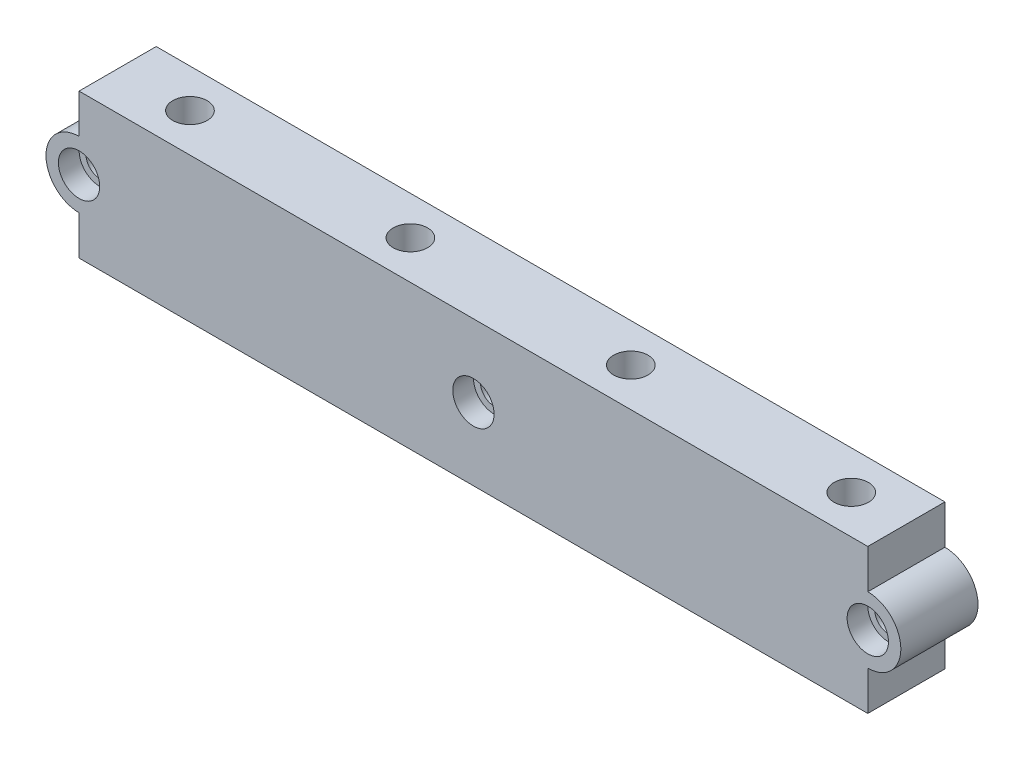
ISO-10303-21;
HEADER;
FILE_DESCRIPTION(('STEP AP214'),'2;1');
FILE_NAME('part.step','',(''),(''),'','','');
FILE_SCHEMA(('AUTOMOTIVE_DESIGN { 1 0 10303 214 1 1 1 1 }'));
ENDSEC;
DATA;
#1=APPLICATION_CONTEXT('core data for automotive mechanical design processes');
#2=APPLICATION_PROTOCOL_DEFINITION('international standard','automotive_design',2000,#1);
#3=PRODUCT_CONTEXT('',#1,'mechanical');
#4=PRODUCT('Part','Part','',(#3));
#5=PRODUCT_RELATED_PRODUCT_CATEGORY('part','',(#4));
#6=PRODUCT_DEFINITION_FORMATION('','',#4);
#7=PRODUCT_DEFINITION_CONTEXT('part definition',#1,'design');
#8=PRODUCT_DEFINITION('design','',#6,#7);
#9=PRODUCT_DEFINITION_SHAPE('','',#8);
#10=(LENGTH_UNIT() NAMED_UNIT(*) SI_UNIT(.MILLI.,.METRE.));
#11=(NAMED_UNIT(*) PLANE_ANGLE_UNIT() SI_UNIT($,.RADIAN.));
#12=(NAMED_UNIT(*) SI_UNIT($,.STERADIAN.) SOLID_ANGLE_UNIT());
#13=UNCERTAINTY_MEASURE_WITH_UNIT(LENGTH_MEASURE(1.E-05),#10,'distance_accuracy_value','');
#14=(GEOMETRIC_REPRESENTATION_CONTEXT(3) GLOBAL_UNCERTAINTY_ASSIGNED_CONTEXT((#13)) GLOBAL_UNIT_ASSIGNED_CONTEXT((#10,
#11,#12)) REPRESENTATION_CONTEXT('',''));
#15=CARTESIAN_POINT('',(0.,0.,0.));
#16=DIRECTION('',(0.,0.,1.));
#17=DIRECTION('',(1.,0.,0.));
#18=AXIS2_PLACEMENT_3D('',#15,#16,#17);
#19=CARTESIAN_POINT('',(0.,0.,-17.78));
#20=DIRECTION('',(0.,0.,1.));
#21=DIRECTION('',(1.,0.,0.));
#22=AXIS2_PLACEMENT_3D('',#19,#20,#21);
#23=CYLINDRICAL_SURFACE('',#22,3.175);
#24=CARTESIAN_POINT('',(0.,0.,-17.78));
#25=DIRECTION('',(0.,0.,1.));
#26=DIRECTION('',(1.,0.,0.));
#27=AXIS2_PLACEMENT_3D('',#24,#25,#26);
#28=CIRCLE('',#27,3.175);
#29=CARTESIAN_POINT('',(3.175,0.,-17.78));
#30=VERTEX_POINT('',#29);
#31=EDGE_CURVE('E140',#30,#30,#28,.T.);
#32=ORIENTED_EDGE('',*,*,#31,.F.);
#33=EDGE_LOOP('',(#32));
#34=FACE_BOUND('',#33,.T.);
#35=CARTESIAN_POINT('',(0.,0.,-4.7752));
#36=DIRECTION('',(0.,0.,1.));
#37=DIRECTION('',(1.,0.,0.));
#38=AXIS2_PLACEMENT_3D('',#35,#36,#37);
#39=CIRCLE('',#38,3.175);
#40=CARTESIAN_POINT('',(3.175,0.,-4.7752));
#41=VERTEX_POINT('',#40);
#42=EDGE_CURVE('E41',#41,#41,#39,.F.);
#43=ORIENTED_EDGE('',*,*,#42,.F.);
#44=EDGE_LOOP('',(#43));
#45=FACE_BOUND('',#44,.T.);
#46=ADVANCED_FACE('F37',(#34,#45),#23,.F.);
#47=CARTESIAN_POINT('',(-181.76875,0.,-17.78));
#48=DIRECTION('',(0.,0.,1.));
#49=DIRECTION('',(1.,0.,0.));
#50=AXIS2_PLACEMENT_3D('',#47,#48,#49);
#51=CYLINDRICAL_SURFACE('',#50,3.17499999999997);
#52=CARTESIAN_POINT('',(-181.76875,0.,-17.78));
#53=DIRECTION('',(0.,0.,1.));
#54=DIRECTION('',(1.,0.,0.));
#55=AXIS2_PLACEMENT_3D('',#52,#53,#54);
#56=CIRCLE('',#55,3.17499999999997);
#57=CARTESIAN_POINT('',(-178.59375,0.,-17.78));
#58=VERTEX_POINT('',#57);
#59=EDGE_CURVE('E194',#58,#58,#56,.T.);
#60=ORIENTED_EDGE('',*,*,#59,.F.);
#61=EDGE_LOOP('',(#60));
#62=FACE_BOUND('',#61,.T.);
#63=CARTESIAN_POINT('',(-181.76875,0.,-4.7752));
#64=DIRECTION('',(0.,0.,1.));
#65=DIRECTION('',(1.,0.,0.));
#66=AXIS2_PLACEMENT_3D('',#63,#64,#65);
#67=CIRCLE('',#66,3.17499999999997);
#68=CARTESIAN_POINT('',(-178.59375,0.,-4.7752));
#69=VERTEX_POINT('',#68);
#70=EDGE_CURVE('E170',#69,#69,#67,.F.);
#71=ORIENTED_EDGE('',*,*,#70,.F.);
#72=EDGE_LOOP('',(#71));
#73=FACE_BOUND('',#72,.T.);
#74=ADVANCED_FACE('F230',(#62,#73),#51,.F.);
#75=CARTESIAN_POINT('',(-90.884375,0.,-17.78));
#76=DIRECTION('',(0.,0.,1.));
#77=DIRECTION('',(1.,0.,0.));
#78=AXIS2_PLACEMENT_3D('',#75,#76,#77);
#79=CYLINDRICAL_SURFACE('',#78,3.175);
#80=CARTESIAN_POINT('',(-90.884375,0.,-17.78));
#81=DIRECTION('',(0.,0.,1.));
#82=DIRECTION('',(1.,0.,0.));
#83=AXIS2_PLACEMENT_3D('',#80,#81,#82);
#84=CIRCLE('',#83,3.175);
#85=CARTESIAN_POINT('',(-87.709375,0.,-17.78));
#86=VERTEX_POINT('',#85);
#87=EDGE_CURVE('E191',#86,#86,#84,.T.);
#88=ORIENTED_EDGE('',*,*,#87,.F.);
#89=EDGE_LOOP('',(#88));
#90=FACE_BOUND('',#89,.T.);
#91=CARTESIAN_POINT('',(-90.884375,0.,-4.7752));
#92=DIRECTION('',(0.,0.,1.));
#93=DIRECTION('',(1.,0.,0.));
#94=AXIS2_PLACEMENT_3D('',#91,#92,#93);
#95=CIRCLE('',#94,3.175);
#96=CARTESIAN_POINT('',(-87.709375,0.,-4.7752));
#97=VERTEX_POINT('',#96);
#98=EDGE_CURVE('E168',#97,#97,#95,.F.);
#99=ORIENTED_EDGE('',*,*,#98,.F.);
#100=EDGE_LOOP('',(#99));
#101=FACE_BOUND('',#100,.T.);
#102=ADVANCED_FACE('F226',(#90,#101),#79,.F.);
#103=CARTESIAN_POINT('',(0.,16.66875,-17.78));
#104=DIRECTION('',(0.,1.,0.));
#105=DIRECTION('',(-1.,0.,0.));
#106=AXIS2_PLACEMENT_3D('',#103,#104,#105);
#107=PLANE('',#106);
#108=CARTESIAN_POINT('',(-12.7,16.66875,-8.89));
#109=DIRECTION('',(0.,1.,0.));
#110=DIRECTION('',(0.,0.,1.));
#111=AXIS2_PLACEMENT_3D('',#108,#109,#110);
#112=CIRCLE('',#111,3.96875);
#113=CARTESIAN_POINT('',(-12.7,16.66875,-4.92125));
#114=VERTEX_POINT('',#113);
#115=EDGE_CURVE('E270',#114,#114,#112,.T.);
#116=ORIENTED_EDGE('',*,*,#115,.F.);
#117=EDGE_LOOP('',(#116));
#118=FACE_BOUND('',#117,.T.);
#119=CARTESIAN_POINT('',(-63.5,16.66875,-8.88999999999965));
#120=DIRECTION('',(0.,1.,0.));
#121=DIRECTION('',(0.,0.,1.));
#122=AXIS2_PLACEMENT_3D('',#119,#120,#121);
#123=CIRCLE('',#122,3.96875);
#124=CARTESIAN_POINT('',(-63.5,16.66875,-4.92124999999964));
#125=VERTEX_POINT('',#124);
#126=EDGE_CURVE('E276',#125,#125,#123,.T.);
#127=ORIENTED_EDGE('',*,*,#126,.F.);
#128=EDGE_LOOP('',(#127));
#129=FACE_BOUND('',#128,.T.);
#130=CARTESIAN_POINT('',(-114.3,16.66875,-8.88999999999929));
#131=DIRECTION('',(0.,1.,0.));
#132=DIRECTION('',(0.,0.,1.));
#133=AXIS2_PLACEMENT_3D('',#130,#131,#132);
#134=CIRCLE('',#133,3.96874999999999);
#135=CARTESIAN_POINT('',(-114.3,16.66875,-4.9212499999993));
#136=VERTEX_POINT('',#135);
#137=EDGE_CURVE('E185',#136,#136,#134,.T.);
#138=ORIENTED_EDGE('',*,*,#137,.F.);
#139=EDGE_LOOP('',(#138));
#140=FACE_BOUND('',#139,.T.);
#141=CARTESIAN_POINT('',(-165.1,16.66875,-8.88999999999893));
#142=DIRECTION('',(0.,1.,0.));
#143=DIRECTION('',(0.,0.,1.));
#144=AXIS2_PLACEMENT_3D('',#141,#142,#143);
#145=CIRCLE('',#144,3.96875000000002);
#146=CARTESIAN_POINT('',(-165.1,16.66875,-4.92124999999892));
#147=VERTEX_POINT('',#146);
#148=EDGE_CURVE('E176',#147,#147,#145,.T.);
#149=ORIENTED_EDGE('',*,*,#148,.F.);
#150=EDGE_LOOP('',(#149));
#151=FACE_BOUND('',#150,.T.);
#152=DIRECTION('',(-1.,0.,0.));
#153=VECTOR('',#152,1.);
#154=CARTESIAN_POINT('',(0.,16.66875,0.));
#155=LINE('',#154,#153);
#156=CARTESIAN_POINT('',(0.,16.66875,0.));
#157=VERTEX_POINT('',#156);
#158=CARTESIAN_POINT('',(-181.76875,16.66875,0.));
#159=VERTEX_POINT('',#158);
#160=EDGE_CURVE('E136',#157,#159,#155,.T.);
#161=ORIENTED_EDGE('',*,*,#160,.F.);
#162=DIRECTION('',(0.,0.,1.));
#163=VECTOR('',#162,1.);
#164=CARTESIAN_POINT('',(0.,16.66875,-17.78));
#165=LINE('',#164,#163);
#166=CARTESIAN_POINT('',(0.,16.66875,-17.78));
#167=VERTEX_POINT('',#166);
#168=EDGE_CURVE('E11',#167,#157,#165,.T.);
#169=ORIENTED_EDGE('',*,*,#168,.F.);
#170=DIRECTION('',(-1.,0.,0.));
#171=VECTOR('',#170,1.);
#172=CARTESIAN_POINT('',(0.,16.66875,-17.78));
#173=LINE('',#172,#171);
#174=CARTESIAN_POINT('',(-181.76875,16.66875,-17.78));
#175=VERTEX_POINT('',#174);
#176=EDGE_CURVE('E157',#167,#175,#173,.T.);
#177=ORIENTED_EDGE('',*,*,#176,.T.);
#178=DIRECTION('',(0.,0.,1.));
#179=VECTOR('',#178,1.);
#180=CARTESIAN_POINT('',(-181.76875,16.66875,-17.78));
#181=LINE('',#180,#179);
#182=EDGE_CURVE('E94',#175,#159,#181,.T.);
#183=ORIENTED_EDGE('',*,*,#182,.T.);
#184=EDGE_LOOP('',(#161,#169,#177,#183));
#185=FACE_BOUND('',#184,.T.);
#186=ADVANCED_FACE('F39',(#118,#129,#140,#151,#185),#107,.T.);
#187=CARTESIAN_POINT('',(0.,16.66875,-17.78));
#188=DIRECTION('',(1.,0.,0.));
#189=DIRECTION('',(0.,1.,0.));
#190=AXIS2_PLACEMENT_3D('',#187,#188,#189);
#191=PLANE('',#190);
#192=DIRECTION('',(0.,1.,0.));
#193=VECTOR('',#192,1.);
#194=CARTESIAN_POINT('',(0.,16.66875,0.));
#195=LINE('',#194,#193);
#196=CARTESIAN_POINT('',(0.,7.62,0.));
#197=VERTEX_POINT('',#196);
#198=EDGE_CURVE('E155',#197,#157,#195,.T.);
#199=ORIENTED_EDGE('',*,*,#198,.F.);
#200=DIRECTION('',(0.,0.,1.));
#201=VECTOR('',#200,1.);
#202=CARTESIAN_POINT('',(0.,7.62,-17.78));
#203=LINE('',#202,#201);
#204=CARTESIAN_POINT('',(0.,7.62,-17.78));
#205=VERTEX_POINT('',#204);
#206=EDGE_CURVE('E47',#205,#197,#203,.T.);
#207=ORIENTED_EDGE('',*,*,#206,.F.);
#208=DIRECTION('',(0.,1.,0.));
#209=VECTOR('',#208,1.);
#210=CARTESIAN_POINT('',(0.,16.66875,-17.78));
#211=LINE('',#210,#209);
#212=EDGE_CURVE('E126',#205,#167,#211,.T.);
#213=ORIENTED_EDGE('',*,*,#212,.T.);
#214=ORIENTED_EDGE('',*,*,#168,.T.);
#215=EDGE_LOOP('',(#199,#207,#213,#214));
#216=FACE_BOUND('',#215,.T.);
#217=ADVANCED_FACE('F218',(#216),#191,.T.);
#218=CARTESIAN_POINT('',(0.,0.,-17.78));
#219=DIRECTION('',(0.,0.,1.));
#220=DIRECTION('',(1.,0.,0.));
#221=AXIS2_PLACEMENT_3D('',#218,#219,#220);
#222=CYLINDRICAL_SURFACE('',#221,7.62);
#223=CARTESIAN_POINT('',(0.,0.,0.));
#224=DIRECTION('',(0.,0.,1.));
#225=DIRECTION('',(1.,0.,0.));
#226=AXIS2_PLACEMENT_3D('',#223,#224,#225);
#227=CIRCLE('',#226,7.62);
#228=CARTESIAN_POINT('',(0.,-7.62,0.));
#229=VERTEX_POINT('',#228);
#230=EDGE_CURVE('E113',#229,#197,#227,.T.);
#231=ORIENTED_EDGE('',*,*,#230,.F.);
#232=DIRECTION('',(0.,0.,1.));
#233=VECTOR('',#232,1.);
#234=CARTESIAN_POINT('',(0.,-7.62,-17.78));
#235=LINE('',#234,#233);
#236=CARTESIAN_POINT('',(0.,-7.62,-17.78));
#237=VERTEX_POINT('',#236);
#238=EDGE_CURVE('E108',#237,#229,#235,.T.);
#239=ORIENTED_EDGE('',*,*,#238,.F.);
#240=CARTESIAN_POINT('',(0.,0.,-17.78));
#241=DIRECTION('',(0.,0.,1.));
#242=DIRECTION('',(1.,0.,0.));
#243=AXIS2_PLACEMENT_3D('',#240,#241,#242);
#244=CIRCLE('',#243,7.62);
#245=EDGE_CURVE('E111',#237,#205,#244,.T.);
#246=ORIENTED_EDGE('',*,*,#245,.T.);
#247=ORIENTED_EDGE('',*,*,#206,.T.);
#248=EDGE_LOOP('',(#231,#239,#246,#247));
#249=FACE_BOUND('',#248,.T.);
#250=ADVANCED_FACE('F110',(#249),#222,.T.);
#251=CARTESIAN_POINT('',(0.,-16.66875,-17.78));
#252=DIRECTION('',(1.,0.,0.));
#253=DIRECTION('',(0.,0.,-1.));
#254=AXIS2_PLACEMENT_3D('',#251,#252,#253);
#255=PLANE('',#254);
#256=DIRECTION('',(0.,1.,0.));
#257=VECTOR('',#256,1.);
#258=CARTESIAN_POINT('',(0.,-16.66875,0.));
#259=LINE('',#258,#257);
#260=CARTESIAN_POINT('',(0.,-16.66875,0.));
#261=VERTEX_POINT('',#260);
#262=EDGE_CURVE('E152',#261,#229,#259,.T.);
#263=ORIENTED_EDGE('',*,*,#262,.F.);
#264=DIRECTION('',(0.,0.,1.));
#265=VECTOR('',#264,1.);
#266=CARTESIAN_POINT('',(0.,-16.66875,-17.78));
#267=LINE('',#266,#265);
#268=CARTESIAN_POINT('',(0.,-16.66875,-17.78));
#269=VERTEX_POINT('',#268);
#270=EDGE_CURVE('E118',#269,#261,#267,.T.);
#271=ORIENTED_EDGE('',*,*,#270,.F.);
#272=DIRECTION('',(0.,1.,0.));
#273=VECTOR('',#272,1.);
#274=CARTESIAN_POINT('',(0.,-16.66875,-17.78));
#275=LINE('',#274,#273);
#276=EDGE_CURVE('E124',#269,#237,#275,.T.);
#277=ORIENTED_EDGE('',*,*,#276,.T.);
#278=ORIENTED_EDGE('',*,*,#238,.T.);
#279=EDGE_LOOP('',(#263,#271,#277,#278));
#280=FACE_BOUND('',#279,.T.);
#281=ADVANCED_FACE('F128',(#280),#255,.T.);
#282=CARTESIAN_POINT('',(-181.76875,-16.66875,-17.78));
#283=DIRECTION('',(0.,-1.,0.));
#284=DIRECTION('',(1.,0.,0.));
#285=AXIS2_PLACEMENT_3D('',#282,#283,#284);
#286=PLANE('',#285);
#287=CARTESIAN_POINT('',(-12.7,-16.66875,-8.89));
#288=DIRECTION('',(0.,-1.,0.));
#289=DIRECTION('',(1.,0.,0.));
#290=AXIS2_PLACEMENT_3D('',#287,#288,#289);
#291=CIRCLE('',#290,3.96875);
#292=CARTESIAN_POINT('',(-8.73124999999999,-16.66875,-8.89));
#293=VERTEX_POINT('',#292);
#294=EDGE_CURVE('E195',#293,#293,#291,.F.);
#295=ORIENTED_EDGE('',*,*,#294,.T.);
#296=EDGE_LOOP('',(#295));
#297=FACE_BOUND('',#296,.T.);
#298=CARTESIAN_POINT('',(-63.5,-16.66875,-8.88999999999965));
#299=DIRECTION('',(0.,-1.,0.));
#300=DIRECTION('',(1.,0.,0.));
#301=AXIS2_PLACEMENT_3D('',#298,#299,#300);
#302=CIRCLE('',#301,3.96875);
#303=CARTESIAN_POINT('',(-59.53125,-16.66875,-8.88999999999965));
#304=VERTEX_POINT('',#303);
#305=EDGE_CURVE('E273',#304,#304,#302,.F.);
#306=ORIENTED_EDGE('',*,*,#305,.T.);
#307=EDGE_LOOP('',(#306));
#308=FACE_BOUND('',#307,.T.);
#309=CARTESIAN_POINT('',(-114.3,-16.66875,-8.88999999999929));
#310=DIRECTION('',(0.,-1.,0.));
#311=DIRECTION('',(1.,0.,0.));
#312=AXIS2_PLACEMENT_3D('',#309,#310,#311);
#313=CIRCLE('',#312,3.96874999999999);
#314=CARTESIAN_POINT('',(-110.33125,-16.66875,-8.88999999999929));
#315=VERTEX_POINT('',#314);
#316=EDGE_CURVE('E188',#315,#315,#313,.F.);
#317=ORIENTED_EDGE('',*,*,#316,.T.);
#318=EDGE_LOOP('',(#317));
#319=FACE_BOUND('',#318,.T.);
#320=CARTESIAN_POINT('',(-165.1,-16.66875,-8.88999999999893));
#321=DIRECTION('',(0.,-1.,0.));
#322=DIRECTION('',(1.,0.,0.));
#323=AXIS2_PLACEMENT_3D('',#320,#321,#322);
#324=CIRCLE('',#323,3.96875000000002);
#325=CARTESIAN_POINT('',(-161.13125,-16.66875,-8.88999999999893));
#326=VERTEX_POINT('',#325);
#327=EDGE_CURVE('E180',#326,#326,#324,.F.);
#328=ORIENTED_EDGE('',*,*,#327,.T.);
#329=EDGE_LOOP('',(#328));
#330=FACE_BOUND('',#329,.T.);
#331=DIRECTION('',(1.,0.,0.));
#332=VECTOR('',#331,1.);
#333=CARTESIAN_POINT('',(-181.76875,-16.66875,0.));
#334=LINE('',#333,#332);
#335=CARTESIAN_POINT('',(-181.76875,-16.66875,0.));
#336=VERTEX_POINT('',#335);
#337=EDGE_CURVE('E149',#336,#261,#334,.T.);
#338=ORIENTED_EDGE('',*,*,#337,.F.);
#339=DIRECTION('',(0.,0.,1.));
#340=VECTOR('',#339,1.);
#341=CARTESIAN_POINT('',(-181.76875,-16.66875,-17.78));
#342=LINE('',#341,#340);
#343=CARTESIAN_POINT('',(-181.76875,-16.66875,-17.78));
#344=VERTEX_POINT('',#343);
#345=EDGE_CURVE('E161',#344,#336,#342,.T.);
#346=ORIENTED_EDGE('',*,*,#345,.F.);
#347=DIRECTION('',(1.,0.,0.));
#348=VECTOR('',#347,1.);
#349=CARTESIAN_POINT('',(-181.76875,-16.66875,-17.78));
#350=LINE('',#349,#348);
#351=EDGE_CURVE('E129',#344,#269,#350,.T.);
#352=ORIENTED_EDGE('',*,*,#351,.T.);
#353=ORIENTED_EDGE('',*,*,#270,.T.);
#354=EDGE_LOOP('',(#338,#346,#352,#353));
#355=FACE_BOUND('',#354,.T.);
#356=ADVANCED_FACE('F286',(#297,#308,#319,#330,#355),#286,.T.);
#357=CARTESIAN_POINT('',(-181.76875,-7.62000000000002,-17.78));
#358=DIRECTION('',(-1.,0.,0.));
#359=DIRECTION('',(0.,0.,1.));
#360=AXIS2_PLACEMENT_3D('',#357,#358,#359);
#361=PLANE('',#360);
#362=DIRECTION('',(0.,-1.,0.));
#363=VECTOR('',#362,1.);
#364=CARTESIAN_POINT('',(-181.76875,-7.62000000000002,0.));
#365=LINE('',#364,#363);
#366=CARTESIAN_POINT('',(-181.76875,-7.62000000000002,0.));
#367=VERTEX_POINT('',#366);
#368=EDGE_CURVE('E146',#367,#336,#365,.T.);
#369=ORIENTED_EDGE('',*,*,#368,.F.);
#370=DIRECTION('',(0.,0.,1.));
#371=VECTOR('',#370,1.);
#372=CARTESIAN_POINT('',(-181.76875,-7.62000000000002,-17.78));
#373=LINE('',#372,#371);
#374=CARTESIAN_POINT('',(-181.76875,-7.62000000000002,-17.78));
#375=VERTEX_POINT('',#374);
#376=EDGE_CURVE('E163',#375,#367,#373,.T.);
#377=ORIENTED_EDGE('',*,*,#376,.F.);
#378=DIRECTION('',(0.,-1.,0.));
#379=VECTOR('',#378,1.);
#380=CARTESIAN_POINT('',(-181.76875,-7.62000000000002,-17.78));
#381=LINE('',#380,#379);
#382=EDGE_CURVE('E131',#375,#344,#381,.T.);
#383=ORIENTED_EDGE('',*,*,#382,.T.);
#384=ORIENTED_EDGE('',*,*,#345,.T.);
#385=EDGE_LOOP('',(#369,#377,#383,#384));
#386=FACE_BOUND('',#385,.T.);
#387=ADVANCED_FACE('F209',(#386),#361,.T.);
#388=CARTESIAN_POINT('',(-181.76875,0.,-17.78));
#389=DIRECTION('',(0.,0.,1.));
#390=DIRECTION('',(1.,0.,0.));
#391=AXIS2_PLACEMENT_3D('',#388,#389,#390);
#392=CYLINDRICAL_SURFACE('',#391,7.62);
#393=CARTESIAN_POINT('',(-181.76875,0.,0.));
#394=DIRECTION('',(0.,0.,1.));
#395=DIRECTION('',(1.,0.,0.));
#396=AXIS2_PLACEMENT_3D('',#393,#394,#395);
#397=CIRCLE('',#396,7.62);
#398=CARTESIAN_POINT('',(-181.76875,7.61999999999998,0.));
#399=VERTEX_POINT('',#398);
#400=EDGE_CURVE('E143',#399,#367,#397,.T.);
#401=ORIENTED_EDGE('',*,*,#400,.F.);
#402=DIRECTION('',(0.,0.,1.));
#403=VECTOR('',#402,1.);
#404=CARTESIAN_POINT('',(-181.76875,7.61999999999998,-17.78));
#405=LINE('',#404,#403);
#406=CARTESIAN_POINT('',(-181.76875,7.61999999999998,-17.78));
#407=VERTEX_POINT('',#406);
#408=EDGE_CURVE('E165',#407,#399,#405,.T.);
#409=ORIENTED_EDGE('',*,*,#408,.F.);
#410=CARTESIAN_POINT('',(-181.76875,0.,-17.78));
#411=DIRECTION('',(0.,0.,1.));
#412=DIRECTION('',(1.,0.,0.));
#413=AXIS2_PLACEMENT_3D('',#410,#411,#412);
#414=CIRCLE('',#413,7.62);
#415=EDGE_CURVE('E203',#407,#375,#414,.T.);
#416=ORIENTED_EDGE('',*,*,#415,.T.);
#417=ORIENTED_EDGE('',*,*,#376,.T.);
#418=EDGE_LOOP('',(#401,#409,#416,#417));
#419=FACE_BOUND('',#418,.T.);
#420=ADVANCED_FACE('F214',(#419),#392,.T.);
#421=CARTESIAN_POINT('',(-181.76875,16.66875,-17.78));
#422=DIRECTION('',(-1.,0.,0.));
#423=DIRECTION('',(0.,0.,1.));
#424=AXIS2_PLACEMENT_3D('',#421,#422,#423);
#425=PLANE('',#424);
#426=DIRECTION('',(0.,-1.,0.));
#427=VECTOR('',#426,1.);
#428=CARTESIAN_POINT('',(-181.76875,16.66875,0.));
#429=LINE('',#428,#427);
#430=EDGE_CURVE('E139',#159,#399,#429,.T.);
#431=ORIENTED_EDGE('',*,*,#430,.F.);
#432=ORIENTED_EDGE('',*,*,#182,.F.);
#433=DIRECTION('',(0.,-1.,0.));
#434=VECTOR('',#433,1.);
#435=CARTESIAN_POINT('',(-181.76875,16.66875,-17.78));
#436=LINE('',#435,#434);
#437=EDGE_CURVE('E201',#175,#407,#436,.T.);
#438=ORIENTED_EDGE('',*,*,#437,.T.);
#439=ORIENTED_EDGE('',*,*,#408,.T.);
#440=EDGE_LOOP('',(#431,#432,#438,#439));
#441=FACE_BOUND('',#440,.T.);
#442=ADVANCED_FACE('F215',(#441),#425,.T.);
#443=CARTESIAN_POINT('',(-181.76875,0.,-17.78));
#444=DIRECTION('',(0.,0.,1.));
#445=DIRECTION('',(1.,0.,0.));
#446=AXIS2_PLACEMENT_3D('',#443,#444,#445);
#447=PLANE('',#446);
#448=ORIENTED_EDGE('',*,*,#87,.T.);
#449=EDGE_LOOP('',(#448));
#450=FACE_BOUND('',#449,.T.);
#451=ORIENTED_EDGE('',*,*,#59,.T.);
#452=EDGE_LOOP('',(#451));
#453=FACE_BOUND('',#452,.T.);
#454=ORIENTED_EDGE('',*,*,#31,.T.);
#455=EDGE_LOOP('',(#454));
#456=FACE_BOUND('',#455,.T.);
#457=ORIENTED_EDGE('',*,*,#176,.F.);
#458=ORIENTED_EDGE('',*,*,#212,.F.);
#459=ORIENTED_EDGE('',*,*,#245,.F.);
#460=ORIENTED_EDGE('',*,*,#276,.F.);
#461=ORIENTED_EDGE('',*,*,#351,.F.);
#462=ORIENTED_EDGE('',*,*,#382,.F.);
#463=ORIENTED_EDGE('',*,*,#415,.F.);
#464=ORIENTED_EDGE('',*,*,#437,.F.);
#465=EDGE_LOOP('',(#457,#458,#459,#460,#461,#462,#463,#464));
#466=FACE_BOUND('',#465,.T.);
#467=ADVANCED_FACE('F122',(#450,#453,#456,#466),#447,.F.);
#468=CARTESIAN_POINT('',(-181.76875,0.,0.));
#469=DIRECTION('',(0.,0.,1.));
#470=DIRECTION('',(1.,0.,0.));
#471=AXIS2_PLACEMENT_3D('',#468,#469,#470);
#472=PLANE('',#471);
#473=CARTESIAN_POINT('',(0.,0.,0.));
#474=DIRECTION('',(0.,0.,1.));
#475=DIRECTION('',(1.,0.,0.));
#476=AXIS2_PLACEMENT_3D('',#473,#474,#475);
#477=CIRCLE('',#476,4.7625);
#478=CARTESIAN_POINT('',(4.7625,0.,0.));
#479=VERTEX_POINT('',#478);
#480=EDGE_CURVE('E255',#479,#479,#477,.T.);
#481=ORIENTED_EDGE('',*,*,#480,.F.);
#482=EDGE_LOOP('',(#481));
#483=FACE_BOUND('',#482,.T.);
#484=CARTESIAN_POINT('',(-90.884375,0.,0.));
#485=DIRECTION('',(0.,0.,1.));
#486=DIRECTION('',(1.,0.,0.));
#487=AXIS2_PLACEMENT_3D('',#484,#485,#486);
#488=CIRCLE('',#487,4.7625);
#489=CARTESIAN_POINT('',(-86.121875,0.,0.));
#490=VERTEX_POINT('',#489);
#491=EDGE_CURVE('E259',#490,#490,#488,.T.);
#492=ORIENTED_EDGE('',*,*,#491,.F.);
#493=EDGE_LOOP('',(#492));
#494=FACE_BOUND('',#493,.T.);
#495=CARTESIAN_POINT('',(-181.76875,0.,0.));
#496=DIRECTION('',(0.,0.,1.));
#497=DIRECTION('',(1.,0.,0.));
#498=AXIS2_PLACEMENT_3D('',#495,#496,#497);
#499=CIRCLE('',#498,4.76250000000001);
#500=CARTESIAN_POINT('',(-177.00625,0.,0.));
#501=VERTEX_POINT('',#500);
#502=EDGE_CURVE('E262',#501,#501,#499,.T.);
#503=ORIENTED_EDGE('',*,*,#502,.F.);
#504=EDGE_LOOP('',(#503));
#505=FACE_BOUND('',#504,.T.);
#506=ORIENTED_EDGE('',*,*,#160,.T.);
#507=ORIENTED_EDGE('',*,*,#430,.T.);
#508=ORIENTED_EDGE('',*,*,#400,.T.);
#509=ORIENTED_EDGE('',*,*,#368,.T.);
#510=ORIENTED_EDGE('',*,*,#337,.T.);
#511=ORIENTED_EDGE('',*,*,#262,.T.);
#512=ORIENTED_EDGE('',*,*,#230,.T.);
#513=ORIENTED_EDGE('',*,*,#198,.T.);
#514=EDGE_LOOP('',(#506,#507,#508,#509,#510,#511,#512,#513));
#515=FACE_BOUND('',#514,.T.);
#516=ADVANCED_FACE('F217',(#483,#494,#505,#515),#472,.T.);
#517=CARTESIAN_POINT('',(-165.1,-27.8940701513365,-8.88999999999893));
#518=DIRECTION('',(0.,1.,0.));
#519=DIRECTION('',(0.,0.,1.));
#520=AXIS2_PLACEMENT_3D('',#517,#518,#519);
#521=CYLINDRICAL_SURFACE('',#520,3.96875000000002);
#522=ORIENTED_EDGE('',*,*,#148,.T.);
#523=EDGE_LOOP('',(#522));
#524=FACE_BOUND('',#523,.T.);
#525=ORIENTED_EDGE('',*,*,#327,.F.);
#526=EDGE_LOOP('',(#525));
#527=FACE_BOUND('',#526,.T.);
#528=ADVANCED_FACE('F245',(#524,#527),#521,.F.);
#529=CARTESIAN_POINT('',(-114.3,-27.8940701513365,-8.88999999999929));
#530=DIRECTION('',(0.,1.,0.));
#531=DIRECTION('',(0.,0.,1.));
#532=AXIS2_PLACEMENT_3D('',#529,#530,#531);
#533=CYLINDRICAL_SURFACE('',#532,3.96874999999999);
#534=ORIENTED_EDGE('',*,*,#137,.T.);
#535=EDGE_LOOP('',(#534));
#536=FACE_BOUND('',#535,.T.);
#537=ORIENTED_EDGE('',*,*,#316,.F.);
#538=EDGE_LOOP('',(#537));
#539=FACE_BOUND('',#538,.T.);
#540=ADVANCED_FACE('F250',(#536,#539),#533,.F.);
#541=CARTESIAN_POINT('',(-63.5,-27.8940701513365,-8.88999999999965));
#542=DIRECTION('',(0.,1.,0.));
#543=DIRECTION('',(0.,0.,1.));
#544=AXIS2_PLACEMENT_3D('',#541,#542,#543);
#545=CYLINDRICAL_SURFACE('',#544,3.96875);
#546=ORIENTED_EDGE('',*,*,#126,.T.);
#547=EDGE_LOOP('',(#546));
#548=FACE_BOUND('',#547,.T.);
#549=ORIENTED_EDGE('',*,*,#305,.F.);
#550=EDGE_LOOP('',(#549));
#551=FACE_BOUND('',#550,.T.);
#552=ADVANCED_FACE('F290',(#548,#551),#545,.F.);
#553=CARTESIAN_POINT('',(-12.7,-27.8940701513365,-8.89));
#554=DIRECTION('',(0.,1.,0.));
#555=DIRECTION('',(0.,0.,1.));
#556=AXIS2_PLACEMENT_3D('',#553,#554,#555);
#557=CYLINDRICAL_SURFACE('',#556,3.96875);
#558=ORIENTED_EDGE('',*,*,#115,.T.);
#559=EDGE_LOOP('',(#558));
#560=FACE_BOUND('',#559,.T.);
#561=ORIENTED_EDGE('',*,*,#294,.F.);
#562=EDGE_LOOP('',(#561));
#563=FACE_BOUND('',#562,.T.);
#564=ADVANCED_FACE('F295',(#560,#563),#557,.F.);
#565=CARTESIAN_POINT('',(-90.884375,0.,-4.7752));
#566=DIRECTION('',(0.,0.,1.));
#567=DIRECTION('',(1.,0.,0.));
#568=AXIS2_PLACEMENT_3D('',#565,#566,#567);
#569=PLANE('',#568);
#570=CARTESIAN_POINT('',(-90.884375,0.,-4.7752));
#571=DIRECTION('',(0.,0.,1.));
#572=DIRECTION('',(1.,0.,0.));
#573=AXIS2_PLACEMENT_3D('',#570,#571,#572);
#574=CIRCLE('',#573,4.7625);
#575=CARTESIAN_POINT('',(-86.121875,0.,-4.7752));
#576=VERTEX_POINT('',#575);
#577=EDGE_CURVE('E344',#576,#576,#574,.T.);
#578=ORIENTED_EDGE('',*,*,#577,.T.);
#579=EDGE_LOOP('',(#578));
#580=FACE_BOUND('',#579,.T.);
#581=ORIENTED_EDGE('',*,*,#98,.T.);
#582=EDGE_LOOP('',(#581));
#583=FACE_BOUND('',#582,.T.);
#584=ADVANCED_FACE('F307',(#580,#583),#569,.T.);
#585=CARTESIAN_POINT('',(-90.884375,0.,-4.7752));
#586=DIRECTION('',(0.,0.,1.));
#587=DIRECTION('',(1.,0.,0.));
#588=AXIS2_PLACEMENT_3D('',#585,#586,#587);
#589=CYLINDRICAL_SURFACE('',#588,4.7625);
#590=ORIENTED_EDGE('',*,*,#577,.F.);
#591=EDGE_LOOP('',(#590));
#592=FACE_BOUND('',#591,.T.);
#593=ORIENTED_EDGE('',*,*,#491,.T.);
#594=EDGE_LOOP('',(#593));
#595=FACE_BOUND('',#594,.T.);
#596=ADVANCED_FACE('F309',(#592,#595),#589,.F.);
#597=CARTESIAN_POINT('',(-181.76875,0.,-4.7752));
#598=DIRECTION('',(0.,0.,1.));
#599=DIRECTION('',(1.,0.,0.));
#600=AXIS2_PLACEMENT_3D('',#597,#598,#599);
#601=PLANE('',#600);
#602=CARTESIAN_POINT('',(-181.76875,0.,-4.7752));
#603=DIRECTION('',(0.,0.,1.));
#604=DIRECTION('',(1.,0.,0.));
#605=AXIS2_PLACEMENT_3D('',#602,#603,#604);
#606=CIRCLE('',#605,4.76250000000001);
#607=CARTESIAN_POINT('',(-177.00625,0.,-4.7752));
#608=VERTEX_POINT('',#607);
#609=EDGE_CURVE('E264',#608,#608,#606,.T.);
#610=ORIENTED_EDGE('',*,*,#609,.T.);
#611=EDGE_LOOP('',(#610));
#612=FACE_BOUND('',#611,.T.);
#613=ORIENTED_EDGE('',*,*,#70,.T.);
#614=EDGE_LOOP('',(#613));
#615=FACE_BOUND('',#614,.T.);
#616=ADVANCED_FACE('F316',(#612,#615),#601,.T.);
#617=CARTESIAN_POINT('',(-181.76875,0.,-4.7752));
#618=DIRECTION('',(0.,0.,1.));
#619=DIRECTION('',(1.,0.,0.));
#620=AXIS2_PLACEMENT_3D('',#617,#618,#619);
#621=CYLINDRICAL_SURFACE('',#620,4.76250000000001);
#622=ORIENTED_EDGE('',*,*,#609,.F.);
#623=EDGE_LOOP('',(#622));
#624=FACE_BOUND('',#623,.T.);
#625=ORIENTED_EDGE('',*,*,#502,.T.);
#626=EDGE_LOOP('',(#625));
#627=FACE_BOUND('',#626,.T.);
#628=ADVANCED_FACE('F327',(#624,#627),#621,.F.);
#629=CARTESIAN_POINT('',(0.,0.,-4.7752));
#630=DIRECTION('',(0.,0.,1.));
#631=DIRECTION('',(1.,0.,0.));
#632=AXIS2_PLACEMENT_3D('',#629,#630,#631);
#633=PLANE('',#632);
#634=CARTESIAN_POINT('',(0.,0.,-4.7752));
#635=DIRECTION('',(0.,0.,1.));
#636=DIRECTION('',(1.,0.,0.));
#637=AXIS2_PLACEMENT_3D('',#634,#635,#636);
#638=CIRCLE('',#637,4.7625);
#639=CARTESIAN_POINT('',(4.7625,0.,-4.7752));
#640=VERTEX_POINT('',#639);
#641=EDGE_CURVE('E171',#640,#640,#638,.T.);
#642=ORIENTED_EDGE('',*,*,#641,.T.);
#643=EDGE_LOOP('',(#642));
#644=FACE_BOUND('',#643,.T.);
#645=ORIENTED_EDGE('',*,*,#42,.T.);
#646=EDGE_LOOP('',(#645));
#647=FACE_BOUND('',#646,.T.);
#648=ADVANCED_FACE('F330',(#644,#647),#633,.T.);
#649=CARTESIAN_POINT('',(0.,0.,-4.7752));
#650=DIRECTION('',(0.,0.,1.));
#651=DIRECTION('',(1.,0.,0.));
#652=AXIS2_PLACEMENT_3D('',#649,#650,#651);
#653=CYLINDRICAL_SURFACE('',#652,4.7625);
#654=ORIENTED_EDGE('',*,*,#641,.F.);
#655=EDGE_LOOP('',(#654));
#656=FACE_BOUND('',#655,.T.);
#657=ORIENTED_EDGE('',*,*,#480,.T.);
#658=EDGE_LOOP('',(#657));
#659=FACE_BOUND('',#658,.T.);
#660=ADVANCED_FACE('F322',(#656,#659),#653,.F.);
#661=CLOSED_SHELL('',(#46,#74,#102,#186,#217,#250,#281,#356,#387,#420,#442,#467,#516,#528,#540,
#552,#564,#584,#596,#616,#628,#648,#660));
#662=MANIFOLD_SOLID_BREP('B2',#661);
#663=ADVANCED_BREP_SHAPE_REPRESENTATION('',(#18,#662),#14);
#664=SHAPE_DEFINITION_REPRESENTATION(#9,#663);
ENDSEC;
END-ISO-10303-21;
